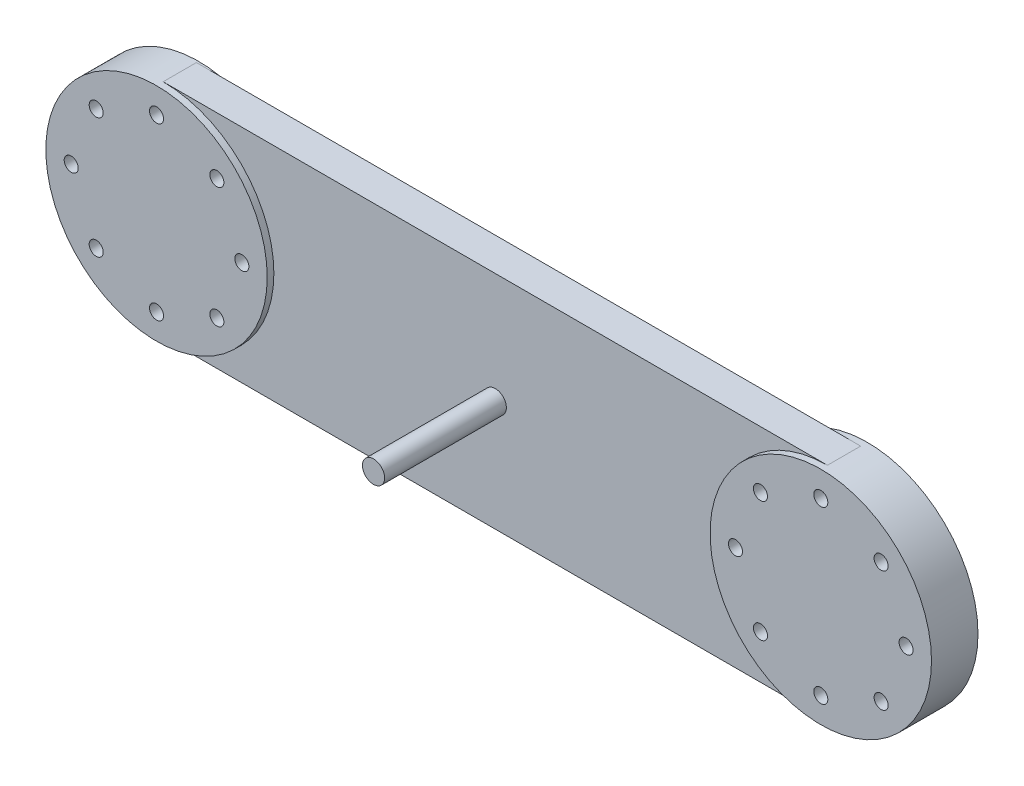
ISO-10303-21;
HEADER;
FILE_DESCRIPTION(('STEP AP214'),'2;1');
FILE_NAME('part.step','',(''),(''),'','','');
FILE_SCHEMA(('AUTOMOTIVE_DESIGN { 1 0 10303 214 1 1 1 1 }'));
ENDSEC;
DATA;
#1=APPLICATION_CONTEXT('core data for automotive mechanical design processes');
#2=APPLICATION_PROTOCOL_DEFINITION('international standard','automotive_design',2000,#1);
#3=PRODUCT_CONTEXT('',#1,'mechanical');
#4=PRODUCT('Part','Part','',(#3));
#5=PRODUCT_RELATED_PRODUCT_CATEGORY('part','',(#4));
#6=PRODUCT_DEFINITION_FORMATION('','',#4);
#7=PRODUCT_DEFINITION_CONTEXT('part definition',#1,'design');
#8=PRODUCT_DEFINITION('design','',#6,#7);
#9=PRODUCT_DEFINITION_SHAPE('','',#8);
#10=(LENGTH_UNIT() NAMED_UNIT(*) SI_UNIT(.MILLI.,.METRE.));
#11=(NAMED_UNIT(*) PLANE_ANGLE_UNIT() SI_UNIT($,.RADIAN.));
#12=(NAMED_UNIT(*) SI_UNIT($,.STERADIAN.) SOLID_ANGLE_UNIT());
#13=UNCERTAINTY_MEASURE_WITH_UNIT(LENGTH_MEASURE(1.E-05),#10,'distance_accuracy_value','');
#14=(GEOMETRIC_REPRESENTATION_CONTEXT(3) GLOBAL_UNCERTAINTY_ASSIGNED_CONTEXT((#13)) GLOBAL_UNIT_ASSIGNED_CONTEXT((#10,
#11,#12)) REPRESENTATION_CONTEXT('',''));
#15=CARTESIAN_POINT('',(0.,0.,0.));
#16=DIRECTION('',(0.,0.,1.));
#17=DIRECTION('',(1.,0.,0.));
#18=AXIS2_PLACEMENT_3D('',#15,#16,#17);
#19=CARTESIAN_POINT('',(-300.,50.,0.));
#20=DIRECTION('',(0.,0.,1.));
#21=DIRECTION('',(1.,0.,0.));
#22=AXIS2_PLACEMENT_3D('',#19,#20,#21);
#23=PLANE('',#22);
#24=CARTESIAN_POINT('',(0.,50.,0.));
#25=DIRECTION('',(0.,0.,1.));
#26=DIRECTION('',(1.,0.,0.));
#27=AXIS2_PLACEMENT_3D('',#24,#25,#26);
#28=CIRCLE('',#27,50.);
#29=CARTESIAN_POINT('',(0.,100.,0.));
#30=VERTEX_POINT('',#29);
#31=CARTESIAN_POINT('',(0.,0.,0.));
#32=VERTEX_POINT('',#31);
#33=EDGE_CURVE('E140',#30,#32,#28,.T.);
#34=ORIENTED_EDGE('',*,*,#33,.T.);
#35=DIRECTION('',(-1.,0.,0.));
#36=VECTOR('',#35,1.);
#37=CARTESIAN_POINT('',(0.,0.,0.));
#38=LINE('',#37,#36);
#39=CARTESIAN_POINT('',(-300.,0.,0.));
#40=VERTEX_POINT('',#39);
#41=EDGE_CURVE('E148',#32,#40,#38,.T.);
#42=ORIENTED_EDGE('',*,*,#41,.T.);
#43=CARTESIAN_POINT('',(-300.,50.,0.));
#44=DIRECTION('',(0.,0.,1.));
#45=DIRECTION('',(1.,0.,0.));
#46=AXIS2_PLACEMENT_3D('',#43,#44,#45);
#47=CIRCLE('',#46,50.);
#48=CARTESIAN_POINT('',(-300.,100.,0.));
#49=VERTEX_POINT('',#48);
#50=EDGE_CURVE('E287',#40,#49,#47,.T.);
#51=ORIENTED_EDGE('',*,*,#50,.T.);
#52=DIRECTION('',(-1.,0.,0.));
#53=VECTOR('',#52,1.);
#54=CARTESIAN_POINT('',(0.,100.,0.));
#55=LINE('',#54,#53);
#56=EDGE_CURVE('E159',#30,#49,#55,.T.);
#57=ORIENTED_EDGE('',*,*,#56,.F.);
#58=EDGE_LOOP('',(#34,#42,#51,#57));
#59=FACE_BOUND('',#58,.T.);
#60=ADVANCED_FACE('F91',(#59),#23,.F.);
#61=CARTESIAN_POINT('',(0.,100.,15.));
#62=DIRECTION('',(0.,-1.,0.));
#63=DIRECTION('',(1.,0.,0.));
#64=AXIS2_PLACEMENT_3D('',#61,#62,#63);
#65=PLANE('',#64);
#66=ORIENTED_EDGE('',*,*,#56,.T.);
#67=DIRECTION('',(0.,0.,-1.));
#68=VECTOR('',#67,1.);
#69=CARTESIAN_POINT('',(-300.,100.,15.));
#70=LINE('',#69,#68);
#71=CARTESIAN_POINT('',(-300.,100.,15.));
#72=VERTEX_POINT('',#71);
#73=EDGE_CURVE('E168',#72,#49,#70,.T.);
#74=ORIENTED_EDGE('',*,*,#73,.F.);
#75=DIRECTION('',(-1.,0.,0.));
#76=VECTOR('',#75,1.);
#77=CARTESIAN_POINT('',(0.,100.,15.));
#78=LINE('',#77,#76);
#79=CARTESIAN_POINT('',(0.,100.,15.));
#80=VERTEX_POINT('',#79);
#81=EDGE_CURVE('E153',#80,#72,#78,.T.);
#82=ORIENTED_EDGE('',*,*,#81,.F.);
#83=DIRECTION('',(0.,0.,-1.));
#84=VECTOR('',#83,1.);
#85=CARTESIAN_POINT('',(0.,100.,15.));
#86=LINE('',#85,#84);
#87=EDGE_CURVE('E100',#80,#30,#86,.T.);
#88=ORIENTED_EDGE('',*,*,#87,.T.);
#89=EDGE_LOOP('',(#66,#74,#82,#88));
#90=FACE_BOUND('',#89,.T.);
#91=ADVANCED_FACE('F310',(#90),#65,.F.);
#92=CARTESIAN_POINT('',(0.,0.,15.));
#93=DIRECTION('',(0.,-1.,0.));
#94=DIRECTION('',(1.,0.,0.));
#95=AXIS2_PLACEMENT_3D('',#92,#93,#94);
#96=PLANE('',#95);
#97=ORIENTED_EDGE('',*,*,#41,.F.);
#98=DIRECTION('',(0.,0.,-1.));
#99=VECTOR('',#98,1.);
#100=CARTESIAN_POINT('',(0.,0.,15.));
#101=LINE('',#100,#99);
#102=CARTESIAN_POINT('',(0.,0.,15.));
#103=VERTEX_POINT('',#102);
#104=EDGE_CURVE('E132',#103,#32,#101,.T.);
#105=ORIENTED_EDGE('',*,*,#104,.F.);
#106=DIRECTION('',(-1.,0.,0.));
#107=VECTOR('',#106,1.);
#108=CARTESIAN_POINT('',(0.,0.,15.));
#109=LINE('',#108,#107);
#110=CARTESIAN_POINT('',(-300.,0.,15.));
#111=VERTEX_POINT('',#110);
#112=EDGE_CURVE('E146',#103,#111,#109,.T.);
#113=ORIENTED_EDGE('',*,*,#112,.T.);
#114=DIRECTION('',(0.,0.,-1.));
#115=VECTOR('',#114,1.);
#116=CARTESIAN_POINT('',(-300.,0.,15.));
#117=LINE('',#116,#115);
#118=EDGE_CURVE('E108',#111,#40,#117,.T.);
#119=ORIENTED_EDGE('',*,*,#118,.T.);
#120=EDGE_LOOP('',(#97,#105,#113,#119));
#121=FACE_BOUND('',#120,.T.);
#122=ADVANCED_FACE('F145',(#121),#96,.T.);
#123=CARTESIAN_POINT('',(0.,0.,15.));
#124=DIRECTION('',(0.,0.,1.));
#125=DIRECTION('',(1.,0.,0.));
#126=AXIS2_PLACEMENT_3D('',#123,#124,#125);
#127=PLANE('',#126);
#128=CARTESIAN_POINT('',(-150.,49.9999999999999,15.));
#129=DIRECTION('',(0.,0.,1.));
#130=DIRECTION('',(1.,0.,0.));
#131=AXIS2_PLACEMENT_3D('',#128,#129,#130);
#132=CIRCLE('',#131,4.99999999999999);
#133=CARTESIAN_POINT('',(-145.,49.9999999999999,15.));
#134=VERTEX_POINT('',#133);
#135=EDGE_CURVE('E163',#134,#134,#132,.F.);
#136=ORIENTED_EDGE('',*,*,#135,.T.);
#137=EDGE_LOOP('',(#136));
#138=FACE_BOUND('',#137,.T.);
#139=ORIENTED_EDGE('',*,*,#112,.F.);
#140=CARTESIAN_POINT('',(0.,50.,15.));
#141=DIRECTION('',(0.,0.,1.));
#142=DIRECTION('',(1.,0.,0.));
#143=AXIS2_PLACEMENT_3D('',#140,#141,#142);
#144=CIRCLE('',#143,50.);
#145=EDGE_CURVE('E129',#103,#80,#144,.F.);
#146=ORIENTED_EDGE('',*,*,#145,.T.);
#147=ORIENTED_EDGE('',*,*,#81,.T.);
#148=CARTESIAN_POINT('',(-300.,50.,15.));
#149=DIRECTION('',(0.,0.,1.));
#150=DIRECTION('',(1.,0.,0.));
#151=AXIS2_PLACEMENT_3D('',#148,#149,#150);
#152=CIRCLE('',#151,50.);
#153=EDGE_CURVE('E12',#72,#111,#152,.F.);
#154=ORIENTED_EDGE('',*,*,#153,.T.);
#155=EDGE_LOOP('',(#139,#146,#147,#154));
#156=FACE_BOUND('',#155,.T.);
#157=ADVANCED_FACE('F151',(#138,#156),#127,.T.);
#158=CARTESIAN_POINT('',(-150.,49.9999999999999,70.));
#159=DIRECTION('',(0.,0.,-1.));
#160=DIRECTION('',(-1.,0.,0.));
#161=AXIS2_PLACEMENT_3D('',#158,#159,#160);
#162=CYLINDRICAL_SURFACE('',#161,4.99999999999999);
#163=ORIENTED_EDGE('',*,*,#135,.F.);
#164=EDGE_LOOP('',(#163));
#165=FACE_BOUND('',#164,.T.);
#166=CARTESIAN_POINT('',(-150.,49.9999999999999,70.));
#167=DIRECTION('',(0.,0.,1.));
#168=DIRECTION('',(1.,0.,0.));
#169=AXIS2_PLACEMENT_3D('',#166,#167,#168);
#170=CIRCLE('',#169,4.99999999999999);
#171=CARTESIAN_POINT('',(-145.,49.9999999999999,70.));
#172=VERTEX_POINT('',#171);
#173=EDGE_CURVE('E175',#172,#172,#170,.T.);
#174=ORIENTED_EDGE('',*,*,#173,.F.);
#175=EDGE_LOOP('',(#174));
#176=FACE_BOUND('',#175,.T.);
#177=ADVANCED_FACE('F296',(#165,#176),#162,.T.);
#178=CARTESIAN_POINT('',(-150.,49.9999999999999,70.));
#179=DIRECTION('',(0.,0.,1.));
#180=DIRECTION('',(1.,0.,0.));
#181=AXIS2_PLACEMENT_3D('',#178,#179,#180);
#182=PLANE('',#181);
#183=ORIENTED_EDGE('',*,*,#173,.T.);
#184=EDGE_LOOP('',(#183));
#185=FACE_BOUND('',#184,.T.);
#186=ADVANCED_FACE('F294',(#185),#182,.T.);
#187=CARTESIAN_POINT('',(-300.,50.,-0.999999999999997));
#188=DIRECTION('',(0.,0.,1.));
#189=DIRECTION('',(1.,0.,0.));
#190=AXIS2_PLACEMENT_3D('',#187,#188,#189);
#191=CYLINDRICAL_SURFACE('',#190,50.);
#192=CARTESIAN_POINT('',(-300.,50.,18.));
#193=DIRECTION('',(0.,0.,1.));
#194=DIRECTION('',(1.,0.,0.));
#195=AXIS2_PLACEMENT_3D('',#192,#193,#194);
#196=CIRCLE('',#195,50.);
#197=CARTESIAN_POINT('',(-250.,50.,18.));
#198=VERTEX_POINT('',#197);
#199=EDGE_CURVE('E279',#198,#198,#196,.T.);
#200=ORIENTED_EDGE('',*,*,#199,.F.);
#201=EDGE_LOOP('',(#200));
#202=FACE_BOUND('',#201,.T.);
#203=CARTESIAN_POINT('',(-300.,50.,-0.999999999999997));
#204=DIRECTION('',(0.,0.,1.));
#205=DIRECTION('',(1.,0.,0.));
#206=AXIS2_PLACEMENT_3D('',#203,#204,#205);
#207=CIRCLE('',#206,50.);
#208=CARTESIAN_POINT('',(-250.,50.,-0.999999999999997));
#209=VERTEX_POINT('',#208);
#210=EDGE_CURVE('E283',#209,#209,#207,.T.);
#211=ORIENTED_EDGE('',*,*,#210,.T.);
#212=EDGE_LOOP('',(#211));
#213=FACE_BOUND('',#212,.T.);
#214=ORIENTED_EDGE('',*,*,#50,.F.);
#215=ORIENTED_EDGE('',*,*,#118,.F.);
#216=ORIENTED_EDGE('',*,*,#153,.F.);
#217=ORIENTED_EDGE('',*,*,#73,.T.);
#218=EDGE_LOOP('',(#214,#215,#216,#217));
#219=FACE_BOUND('',#218,.T.);
#220=ADVANCED_FACE('F304',(#202,#213,#219),#191,.T.);
#221=CARTESIAN_POINT('',(-300.,50.,-0.999999999999997));
#222=DIRECTION('',(0.,0.,1.));
#223=DIRECTION('',(1.,0.,0.));
#224=AXIS2_PLACEMENT_3D('',#221,#222,#223);
#225=PLANE('',#224);
#226=CARTESIAN_POINT('',(-272.754935969733,22.7549359697327,-1.));
#227=DIRECTION('',(0.,0.,1.));
#228=DIRECTION('',(1.,0.,0.));
#229=AXIS2_PLACEMENT_3D('',#226,#227,#228);
#230=CIRCLE('',#229,3.17499999999995);
#231=CARTESIAN_POINT('',(-269.579935969733,22.7549359697327,-1.));
#232=VERTEX_POINT('',#231);
#233=EDGE_CURVE('E262',#232,#232,#230,.T.);
#234=ORIENTED_EDGE('',*,*,#233,.T.);
#235=EDGE_LOOP('',(#234));
#236=FACE_BOUND('',#235,.T.);
#237=CARTESIAN_POINT('',(-300.,11.4696609406727,-1.));
#238=DIRECTION('',(0.,0.,1.));
#239=DIRECTION('',(1.,0.,0.));
#240=AXIS2_PLACEMENT_3D('',#237,#238,#239);
#241=CIRCLE('',#240,3.17499999999997);
#242=CARTESIAN_POINT('',(-296.825,11.4696609406727,-1.));
#243=VERTEX_POINT('',#242);
#244=EDGE_CURVE('E248',#243,#243,#241,.T.);
#245=ORIENTED_EDGE('',*,*,#244,.T.);
#246=EDGE_LOOP('',(#245));
#247=FACE_BOUND('',#246,.T.);
#248=CARTESIAN_POINT('',(-327.245064030267,22.7549359697329,-1.));
#249=DIRECTION('',(0.,0.,1.));
#250=DIRECTION('',(1.,0.,0.));
#251=AXIS2_PLACEMENT_3D('',#248,#249,#250);
#252=CIRCLE('',#251,3.17499999999995);
#253=CARTESIAN_POINT('',(-324.070064030267,22.7549359697329,-1.));
#254=VERTEX_POINT('',#253);
#255=EDGE_CURVE('E244',#254,#254,#252,.T.);
#256=ORIENTED_EDGE('',*,*,#255,.T.);
#257=EDGE_LOOP('',(#256));
#258=FACE_BOUND('',#257,.T.);
#259=CARTESIAN_POINT('',(-338.530339059327,50.0000000000003,-1.));
#260=DIRECTION('',(0.,0.,1.));
#261=DIRECTION('',(1.,0.,0.));
#262=AXIS2_PLACEMENT_3D('',#259,#260,#261);
#263=CIRCLE('',#262,3.17499999999996);
#264=CARTESIAN_POINT('',(-335.355339059327,50.0000000000003,-1.));
#265=VERTEX_POINT('',#264);
#266=EDGE_CURVE('E240',#265,#265,#263,.T.);
#267=ORIENTED_EDGE('',*,*,#266,.T.);
#268=EDGE_LOOP('',(#267));
#269=FACE_BOUND('',#268,.T.);
#270=CARTESIAN_POINT('',(-327.245064030267,77.2450640302675,-1.));
#271=DIRECTION('',(0.,0.,1.));
#272=DIRECTION('',(1.,0.,0.));
#273=AXIS2_PLACEMENT_3D('',#270,#271,#272);
#274=CIRCLE('',#273,3.17499999999997);
#275=CARTESIAN_POINT('',(-324.070064030267,77.2450640302675,-1.));
#276=VERTEX_POINT('',#275);
#277=EDGE_CURVE('E235',#276,#276,#274,.T.);
#278=ORIENTED_EDGE('',*,*,#277,.T.);
#279=EDGE_LOOP('',(#278));
#280=FACE_BOUND('',#279,.T.);
#281=CARTESIAN_POINT('',(-300.,88.5303390593272,-1.));
#282=DIRECTION('',(0.,0.,1.));
#283=DIRECTION('',(1.,0.,0.));
#284=AXIS2_PLACEMENT_3D('',#281,#282,#283);
#285=CIRCLE('',#284,3.17500000000002);
#286=CARTESIAN_POINT('',(-296.825,88.5303390593272,-1.));
#287=VERTEX_POINT('',#286);
#288=EDGE_CURVE('E230',#287,#287,#285,.T.);
#289=ORIENTED_EDGE('',*,*,#288,.T.);
#290=EDGE_LOOP('',(#289));
#291=FACE_BOUND('',#290,.T.);
#292=CARTESIAN_POINT('',(-272.754935969732,77.2450640302669,-1.));
#293=DIRECTION('',(0.,0.,1.));
#294=DIRECTION('',(1.,0.,0.));
#295=AXIS2_PLACEMENT_3D('',#292,#293,#294);
#296=CIRCLE('',#295,3.17499999999998);
#297=CARTESIAN_POINT('',(-269.579935969732,77.2450640302669,-1.));
#298=VERTEX_POINT('',#297);
#299=EDGE_CURVE('E225',#298,#298,#296,.T.);
#300=ORIENTED_EDGE('',*,*,#299,.T.);
#301=EDGE_LOOP('',(#300));
#302=FACE_BOUND('',#301,.T.);
#303=CARTESIAN_POINT('',(-261.469660940673,50.,-1.));
#304=DIRECTION('',(0.,0.,1.));
#305=DIRECTION('',(1.,0.,0.));
#306=AXIS2_PLACEMENT_3D('',#303,#304,#305);
#307=CIRCLE('',#306,3.17499999999997);
#308=CARTESIAN_POINT('',(-258.294660940673,50.,-1.));
#309=VERTEX_POINT('',#308);
#310=EDGE_CURVE('E180',#309,#309,#307,.F.);
#311=ORIENTED_EDGE('',*,*,#310,.F.);
#312=EDGE_LOOP('',(#311));
#313=FACE_BOUND('',#312,.T.);
#314=ORIENTED_EDGE('',*,*,#210,.F.);
#315=EDGE_LOOP('',(#314));
#316=FACE_BOUND('',#315,.T.);
#317=ADVANCED_FACE('F319',(#236,#247,#258,#269,#280,#291,#302,#313,#316),#225,.F.);
#318=CARTESIAN_POINT('',(-300.,50.,18.));
#319=DIRECTION('',(0.,0.,1.));
#320=DIRECTION('',(1.,0.,0.));
#321=AXIS2_PLACEMENT_3D('',#318,#319,#320);
#322=PLANE('',#321);
#323=CARTESIAN_POINT('',(-272.754935969733,22.7549359697327,18.));
#324=DIRECTION('',(0.,0.,1.));
#325=DIRECTION('',(1.,0.,0.));
#326=AXIS2_PLACEMENT_3D('',#323,#324,#325);
#327=CIRCLE('',#326,3.17499999999995);
#328=CARTESIAN_POINT('',(-269.579935969733,22.7549359697327,18.));
#329=VERTEX_POINT('',#328);
#330=EDGE_CURVE('E94',#329,#329,#327,.T.);
#331=ORIENTED_EDGE('',*,*,#330,.F.);
#332=EDGE_LOOP('',(#331));
#333=FACE_BOUND('',#332,.T.);
#334=CARTESIAN_POINT('',(-300.,11.4696609406727,18.));
#335=DIRECTION('',(0.,0.,1.));
#336=DIRECTION('',(1.,0.,0.));
#337=AXIS2_PLACEMENT_3D('',#334,#335,#336);
#338=CIRCLE('',#337,3.17499999999997);
#339=CARTESIAN_POINT('',(-296.825,11.4696609406727,18.));
#340=VERTEX_POINT('',#339);
#341=EDGE_CURVE('E245',#340,#340,#338,.T.);
#342=ORIENTED_EDGE('',*,*,#341,.F.);
#343=EDGE_LOOP('',(#342));
#344=FACE_BOUND('',#343,.T.);
#345=CARTESIAN_POINT('',(-327.245064030267,22.7549359697329,18.));
#346=DIRECTION('',(0.,0.,1.));
#347=DIRECTION('',(1.,0.,0.));
#348=AXIS2_PLACEMENT_3D('',#345,#346,#347);
#349=CIRCLE('',#348,3.17499999999995);
#350=CARTESIAN_POINT('',(-324.070064030267,22.7549359697329,18.));
#351=VERTEX_POINT('',#350);
#352=EDGE_CURVE('E241',#351,#351,#349,.T.);
#353=ORIENTED_EDGE('',*,*,#352,.F.);
#354=EDGE_LOOP('',(#353));
#355=FACE_BOUND('',#354,.T.);
#356=CARTESIAN_POINT('',(-338.530339059327,50.0000000000003,18.));
#357=DIRECTION('',(0.,0.,1.));
#358=DIRECTION('',(1.,0.,0.));
#359=AXIS2_PLACEMENT_3D('',#356,#357,#358);
#360=CIRCLE('',#359,3.17499999999996);
#361=CARTESIAN_POINT('',(-335.355339059327,50.0000000000003,18.));
#362=VERTEX_POINT('',#361);
#363=EDGE_CURVE('E236',#362,#362,#360,.T.);
#364=ORIENTED_EDGE('',*,*,#363,.F.);
#365=EDGE_LOOP('',(#364));
#366=FACE_BOUND('',#365,.T.);
#367=CARTESIAN_POINT('',(-327.245064030267,77.2450640302675,18.));
#368=DIRECTION('',(0.,0.,1.));
#369=DIRECTION('',(1.,0.,0.));
#370=AXIS2_PLACEMENT_3D('',#367,#368,#369);
#371=CIRCLE('',#370,3.17499999999997);
#372=CARTESIAN_POINT('',(-324.070064030267,77.2450640302675,18.));
#373=VERTEX_POINT('',#372);
#374=EDGE_CURVE('E231',#373,#373,#371,.T.);
#375=ORIENTED_EDGE('',*,*,#374,.F.);
#376=EDGE_LOOP('',(#375));
#377=FACE_BOUND('',#376,.T.);
#378=CARTESIAN_POINT('',(-300.,88.5303390593272,18.));
#379=DIRECTION('',(0.,0.,1.));
#380=DIRECTION('',(1.,0.,0.));
#381=AXIS2_PLACEMENT_3D('',#378,#379,#380);
#382=CIRCLE('',#381,3.17500000000002);
#383=CARTESIAN_POINT('',(-296.825,88.5303390593272,18.));
#384=VERTEX_POINT('',#383);
#385=EDGE_CURVE('E226',#384,#384,#382,.T.);
#386=ORIENTED_EDGE('',*,*,#385,.F.);
#387=EDGE_LOOP('',(#386));
#388=FACE_BOUND('',#387,.T.);
#389=CARTESIAN_POINT('',(-272.754935969732,77.2450640302669,18.));
#390=DIRECTION('',(0.,0.,1.));
#391=DIRECTION('',(1.,0.,0.));
#392=AXIS2_PLACEMENT_3D('',#389,#390,#391);
#393=CIRCLE('',#392,3.17499999999998);
#394=CARTESIAN_POINT('',(-269.579935969732,77.2450640302669,18.));
#395=VERTEX_POINT('',#394);
#396=EDGE_CURVE('E221',#395,#395,#393,.T.);
#397=ORIENTED_EDGE('',*,*,#396,.F.);
#398=EDGE_LOOP('',(#397));
#399=FACE_BOUND('',#398,.T.);
#400=CARTESIAN_POINT('',(-261.469660940673,50.,18.));
#401=DIRECTION('',(0.,0.,1.));
#402=DIRECTION('',(1.,0.,0.));
#403=AXIS2_PLACEMENT_3D('',#400,#401,#402);
#404=CIRCLE('',#403,3.17499999999997);
#405=CARTESIAN_POINT('',(-258.294660940673,50.,18.));
#406=VERTEX_POINT('',#405);
#407=EDGE_CURVE('E139',#406,#406,#404,.F.);
#408=ORIENTED_EDGE('',*,*,#407,.T.);
#409=EDGE_LOOP('',(#408));
#410=FACE_BOUND('',#409,.T.);
#411=ORIENTED_EDGE('',*,*,#199,.T.);
#412=EDGE_LOOP('',(#411));
#413=FACE_BOUND('',#412,.T.);
#414=ADVANCED_FACE('F325',(#333,#344,#355,#366,#377,#388,#399,#410,#413),#322,.T.);
#415=CARTESIAN_POINT('',(-261.469660940673,50.,130.));
#416=DIRECTION('',(0.,0.,-1.));
#417=DIRECTION('',(-1.,0.,0.));
#418=AXIS2_PLACEMENT_3D('',#415,#416,#417);
#419=CYLINDRICAL_SURFACE('',#418,3.17499999999997);
#420=ORIENTED_EDGE('',*,*,#407,.F.);
#421=EDGE_LOOP('',(#420));
#422=FACE_BOUND('',#421,.T.);
#423=ORIENTED_EDGE('',*,*,#310,.T.);
#424=EDGE_LOOP('',(#423));
#425=FACE_BOUND('',#424,.T.);
#426=ADVANCED_FACE('F333',(#422,#425),#419,.F.);
#427=CARTESIAN_POINT('',(0.,50.,18.));
#428=DIRECTION('',(0.,0.,-1.));
#429=DIRECTION('',(-1.,0.,0.));
#430=AXIS2_PLACEMENT_3D('',#427,#428,#429);
#431=CYLINDRICAL_SURFACE('',#430,50.);
#432=CARTESIAN_POINT('',(0.,50.,18.));
#433=DIRECTION('',(0.,0.,1.));
#434=DIRECTION('',(1.,0.,0.));
#435=AXIS2_PLACEMENT_3D('',#432,#433,#434);
#436=CIRCLE('',#435,50.);
#437=CARTESIAN_POINT('',(50.,50.,18.));
#438=VERTEX_POINT('',#437);
#439=EDGE_CURVE('E270',#438,#438,#436,.T.);
#440=ORIENTED_EDGE('',*,*,#439,.F.);
#441=EDGE_LOOP('',(#440));
#442=FACE_BOUND('',#441,.T.);
#443=CARTESIAN_POINT('',(0.,50.,-3.));
#444=DIRECTION('',(0.,0.,1.));
#445=DIRECTION('',(1.,0.,0.));
#446=AXIS2_PLACEMENT_3D('',#443,#444,#445);
#447=CIRCLE('',#446,50.);
#448=CARTESIAN_POINT('',(50.,50.,-3.));
#449=VERTEX_POINT('',#448);
#450=EDGE_CURVE('E266',#449,#449,#447,.T.);
#451=ORIENTED_EDGE('',*,*,#450,.T.);
#452=EDGE_LOOP('',(#451));
#453=FACE_BOUND('',#452,.T.);
#454=ORIENTED_EDGE('',*,*,#104,.T.);
#455=ORIENTED_EDGE('',*,*,#33,.F.);
#456=ORIENTED_EDGE('',*,*,#87,.F.);
#457=ORIENTED_EDGE('',*,*,#145,.F.);
#458=EDGE_LOOP('',(#454,#455,#456,#457));
#459=FACE_BOUND('',#458,.T.);
#460=ADVANCED_FACE('F131',(#442,#453,#459),#431,.T.);
#461=CARTESIAN_POINT('',(0.,50.,18.));
#462=DIRECTION('',(0.,0.,1.));
#463=DIRECTION('',(1.,0.,0.));
#464=AXIS2_PLACEMENT_3D('',#461,#462,#463);
#465=PLANE('',#464);
#466=CARTESIAN_POINT('',(-27.2450640302676,22.754935969733,18.));
#467=DIRECTION('',(0.,0.,1.));
#468=DIRECTION('',(1.,0.,0.));
#469=AXIS2_PLACEMENT_3D('',#466,#467,#468);
#470=CIRCLE('',#469,3.17500000000001);
#471=CARTESIAN_POINT('',(-24.0700640302676,22.754935969733,18.));
#472=VERTEX_POINT('',#471);
#473=EDGE_CURVE('E220',#472,#472,#470,.F.);
#474=ORIENTED_EDGE('',*,*,#473,.T.);
#475=EDGE_LOOP('',(#474));
#476=FACE_BOUND('',#475,.T.);
#477=CARTESIAN_POINT('',(-3.7470027081099E-13,11.4696609406726,18.));
#478=DIRECTION('',(0.,0.,1.));
#479=DIRECTION('',(1.,0.,0.));
#480=AXIS2_PLACEMENT_3D('',#477,#478,#479);
#481=CIRCLE('',#480,3.175);
#482=CARTESIAN_POINT('',(3.17499999999962,11.4696609406726,18.));
#483=VERTEX_POINT('',#482);
#484=EDGE_CURVE('E215',#483,#483,#481,.F.);
#485=ORIENTED_EDGE('',*,*,#484,.T.);
#486=EDGE_LOOP('',(#485));
#487=FACE_BOUND('',#486,.T.);
#488=CARTESIAN_POINT('',(38.5303390593274,49.9999999999998,18.));
#489=DIRECTION('',(0.,0.,1.));
#490=DIRECTION('',(1.,0.,0.));
#491=AXIS2_PLACEMENT_3D('',#488,#489,#490);
#492=CIRCLE('',#491,3.175);
#493=CARTESIAN_POINT('',(41.7053390593274,49.9999999999998,18.));
#494=VERTEX_POINT('',#493);
#495=EDGE_CURVE('E210',#494,#494,#492,.F.);
#496=ORIENTED_EDGE('',*,*,#495,.T.);
#497=EDGE_LOOP('',(#496));
#498=FACE_BOUND('',#497,.T.);
#499=CARTESIAN_POINT('',(27.2450640302671,22.7549359697325,18.));
#500=DIRECTION('',(0.,0.,1.));
#501=DIRECTION('',(1.,0.,0.));
#502=AXIS2_PLACEMENT_3D('',#499,#500,#501);
#503=CIRCLE('',#502,3.175);
#504=CARTESIAN_POINT('',(30.4200640302671,22.7549359697325,18.));
#505=VERTEX_POINT('',#504);
#506=EDGE_CURVE('E205',#505,#505,#503,.F.);
#507=ORIENTED_EDGE('',*,*,#506,.T.);
#508=EDGE_LOOP('',(#507));
#509=FACE_BOUND('',#508,.T.);
#510=CARTESIAN_POINT('',(27.2450640302674,77.2450640302672,18.));
#511=DIRECTION('',(0.,0.,1.));
#512=DIRECTION('',(1.,0.,0.));
#513=AXIS2_PLACEMENT_3D('',#510,#511,#512);
#514=CIRCLE('',#513,3.175);
#515=CARTESIAN_POINT('',(30.4200640302674,77.2450640302672,18.));
#516=VERTEX_POINT('',#515);
#517=EDGE_CURVE('E200',#516,#516,#514,.F.);
#518=ORIENTED_EDGE('',*,*,#517,.T.);
#519=EDGE_LOOP('',(#518));
#520=FACE_BOUND('',#519,.T.);
#521=CARTESIAN_POINT('',(0.,88.5303390593274,18.));
#522=DIRECTION('',(0.,0.,1.));
#523=DIRECTION('',(1.,0.,0.));
#524=AXIS2_PLACEMENT_3D('',#521,#522,#523);
#525=CIRCLE('',#524,3.17499999999999);
#526=CARTESIAN_POINT('',(3.17500000000009,88.5303390593274,18.));
#527=VERTEX_POINT('',#526);
#528=EDGE_CURVE('E195',#527,#527,#525,.F.);
#529=ORIENTED_EDGE('',*,*,#528,.T.);
#530=EDGE_LOOP('',(#529));
#531=FACE_BOUND('',#530,.T.);
#532=CARTESIAN_POINT('',(-27.2450640302676,77.2450640302669,18.));
#533=DIRECTION('',(0.,0.,1.));
#534=DIRECTION('',(1.,0.,0.));
#535=AXIS2_PLACEMENT_3D('',#532,#533,#534);
#536=CIRCLE('',#535,3.17499999999998);
#537=CARTESIAN_POINT('',(-24.0700640302676,77.2450640302669,18.));
#538=VERTEX_POINT('',#537);
#539=EDGE_CURVE('E190',#538,#538,#536,.F.);
#540=ORIENTED_EDGE('',*,*,#539,.T.);
#541=EDGE_LOOP('',(#540));
#542=FACE_BOUND('',#541,.T.);
#543=CARTESIAN_POINT('',(-38.5303390593274,50.,18.));
#544=DIRECTION('',(0.,0.,1.));
#545=DIRECTION('',(1.,0.,0.));
#546=AXIS2_PLACEMENT_3D('',#543,#544,#545);
#547=CIRCLE('',#546,3.175);
#548=CARTESIAN_POINT('',(-35.3553390593274,50.,18.));
#549=VERTEX_POINT('',#548);
#550=EDGE_CURVE('E185',#549,#549,#547,.F.);
#551=ORIENTED_EDGE('',*,*,#550,.T.);
#552=EDGE_LOOP('',(#551));
#553=FACE_BOUND('',#552,.T.);
#554=ORIENTED_EDGE('',*,*,#439,.T.);
#555=EDGE_LOOP('',(#554));
#556=FACE_BOUND('',#555,.T.);
#557=ADVANCED_FACE('F340',(#476,#487,#498,#509,#520,#531,#542,#553,#556),#465,.T.);
#558=CARTESIAN_POINT('',(0.,50.,-3.));
#559=DIRECTION('',(0.,0.,1.));
#560=DIRECTION('',(1.,0.,0.));
#561=AXIS2_PLACEMENT_3D('',#558,#559,#560);
#562=PLANE('',#561);
#563=CARTESIAN_POINT('',(-27.2450640302676,22.754935969733,-3.));
#564=DIRECTION('',(0.,0.,1.));
#565=DIRECTION('',(1.,0.,0.));
#566=AXIS2_PLACEMENT_3D('',#563,#564,#565);
#567=CIRCLE('',#566,3.17500000000001);
#568=CARTESIAN_POINT('',(-24.0700640302676,22.754935969733,-3.));
#569=VERTEX_POINT('',#568);
#570=EDGE_CURVE('E216',#569,#569,#567,.F.);
#571=ORIENTED_EDGE('',*,*,#570,.F.);
#572=EDGE_LOOP('',(#571));
#573=FACE_BOUND('',#572,.T.);
#574=CARTESIAN_POINT('',(-3.7470027081099E-13,11.4696609406726,-3.));
#575=DIRECTION('',(0.,0.,1.));
#576=DIRECTION('',(1.,0.,0.));
#577=AXIS2_PLACEMENT_3D('',#574,#575,#576);
#578=CIRCLE('',#577,3.175);
#579=CARTESIAN_POINT('',(3.17499999999962,11.4696609406726,-3.));
#580=VERTEX_POINT('',#579);
#581=EDGE_CURVE('E211',#580,#580,#578,.F.);
#582=ORIENTED_EDGE('',*,*,#581,.F.);
#583=EDGE_LOOP('',(#582));
#584=FACE_BOUND('',#583,.T.);
#585=CARTESIAN_POINT('',(38.5303390593274,49.9999999999998,-3.));
#586=DIRECTION('',(0.,0.,1.));
#587=DIRECTION('',(1.,0.,0.));
#588=AXIS2_PLACEMENT_3D('',#585,#586,#587);
#589=CIRCLE('',#588,3.175);
#590=CARTESIAN_POINT('',(41.7053390593274,49.9999999999998,-3.));
#591=VERTEX_POINT('',#590);
#592=EDGE_CURVE('E206',#591,#591,#589,.F.);
#593=ORIENTED_EDGE('',*,*,#592,.F.);
#594=EDGE_LOOP('',(#593));
#595=FACE_BOUND('',#594,.T.);
#596=CARTESIAN_POINT('',(27.2450640302671,22.7549359697325,-3.));
#597=DIRECTION('',(0.,0.,1.));
#598=DIRECTION('',(1.,0.,0.));
#599=AXIS2_PLACEMENT_3D('',#596,#597,#598);
#600=CIRCLE('',#599,3.175);
#601=CARTESIAN_POINT('',(30.4200640302671,22.7549359697325,-3.));
#602=VERTEX_POINT('',#601);
#603=EDGE_CURVE('E201',#602,#602,#600,.F.);
#604=ORIENTED_EDGE('',*,*,#603,.F.);
#605=EDGE_LOOP('',(#604));
#606=FACE_BOUND('',#605,.T.);
#607=CARTESIAN_POINT('',(27.2450640302674,77.2450640302672,-3.));
#608=DIRECTION('',(0.,0.,1.));
#609=DIRECTION('',(1.,0.,0.));
#610=AXIS2_PLACEMENT_3D('',#607,#608,#609);
#611=CIRCLE('',#610,3.175);
#612=CARTESIAN_POINT('',(30.4200640302674,77.2450640302672,-3.));
#613=VERTEX_POINT('',#612);
#614=EDGE_CURVE('E196',#613,#613,#611,.F.);
#615=ORIENTED_EDGE('',*,*,#614,.F.);
#616=EDGE_LOOP('',(#615));
#617=FACE_BOUND('',#616,.T.);
#618=CARTESIAN_POINT('',(0.,88.5303390593274,-3.));
#619=DIRECTION('',(0.,0.,1.));
#620=DIRECTION('',(1.,0.,0.));
#621=AXIS2_PLACEMENT_3D('',#618,#619,#620);
#622=CIRCLE('',#621,3.17499999999999);
#623=CARTESIAN_POINT('',(3.17500000000009,88.5303390593274,-3.));
#624=VERTEX_POINT('',#623);
#625=EDGE_CURVE('E191',#624,#624,#622,.F.);
#626=ORIENTED_EDGE('',*,*,#625,.F.);
#627=EDGE_LOOP('',(#626));
#628=FACE_BOUND('',#627,.T.);
#629=CARTESIAN_POINT('',(-27.2450640302676,77.2450640302669,-3.));
#630=DIRECTION('',(0.,0.,1.));
#631=DIRECTION('',(1.,0.,0.));
#632=AXIS2_PLACEMENT_3D('',#629,#630,#631);
#633=CIRCLE('',#632,3.17499999999998);
#634=CARTESIAN_POINT('',(-24.0700640302676,77.2450640302669,-3.));
#635=VERTEX_POINT('',#634);
#636=EDGE_CURVE('E186',#635,#635,#633,.F.);
#637=ORIENTED_EDGE('',*,*,#636,.F.);
#638=EDGE_LOOP('',(#637));
#639=FACE_BOUND('',#638,.T.);
#640=CARTESIAN_POINT('',(-38.5303390593274,50.,-3.));
#641=DIRECTION('',(0.,0.,1.));
#642=DIRECTION('',(1.,0.,0.));
#643=AXIS2_PLACEMENT_3D('',#640,#641,#642);
#644=CIRCLE('',#643,3.175);
#645=CARTESIAN_POINT('',(-35.3553390593274,50.,-3.));
#646=VERTEX_POINT('',#645);
#647=EDGE_CURVE('E181',#646,#646,#644,.F.);
#648=ORIENTED_EDGE('',*,*,#647,.F.);
#649=EDGE_LOOP('',(#648));
#650=FACE_BOUND('',#649,.T.);
#651=ORIENTED_EDGE('',*,*,#450,.F.);
#652=EDGE_LOOP('',(#651));
#653=FACE_BOUND('',#652,.T.);
#654=ADVANCED_FACE('F344',(#573,#584,#595,#606,#617,#628,#639,#650,#653),#562,.F.);
#655=CARTESIAN_POINT('',(-38.5303390593274,50.,-98.));
#656=DIRECTION('',(0.,0.,1.));
#657=DIRECTION('',(1.,0.,0.));
#658=AXIS2_PLACEMENT_3D('',#655,#656,#657);
#659=CYLINDRICAL_SURFACE('',#658,3.175);
#660=ORIENTED_EDGE('',*,*,#550,.F.);
#661=EDGE_LOOP('',(#660));
#662=FACE_BOUND('',#661,.T.);
#663=ORIENTED_EDGE('',*,*,#647,.T.);
#664=EDGE_LOOP('',(#663));
#665=FACE_BOUND('',#664,.T.);
#666=ADVANCED_FACE('F348',(#662,#665),#659,.F.);
#667=CARTESIAN_POINT('',(-27.2450640302676,77.2450640302669,-98.));
#668=DIRECTION('',(0.,0.,1.));
#669=DIRECTION('',(1.,0.,0.));
#670=AXIS2_PLACEMENT_3D('',#667,#668,#669);
#671=CYLINDRICAL_SURFACE('',#670,3.17499999999998);
#672=ORIENTED_EDGE('',*,*,#539,.F.);
#673=EDGE_LOOP('',(#672));
#674=FACE_BOUND('',#673,.T.);
#675=ORIENTED_EDGE('',*,*,#636,.T.);
#676=EDGE_LOOP('',(#675));
#677=FACE_BOUND('',#676,.T.);
#678=ADVANCED_FACE('F390',(#674,#677),#671,.F.);
#679=CARTESIAN_POINT('',(0.,88.5303390593274,-98.));
#680=DIRECTION('',(0.,0.,1.));
#681=DIRECTION('',(1.,0.,0.));
#682=AXIS2_PLACEMENT_3D('',#679,#680,#681);
#683=CYLINDRICAL_SURFACE('',#682,3.17499999999999);
#684=ORIENTED_EDGE('',*,*,#528,.F.);
#685=EDGE_LOOP('',(#684));
#686=FACE_BOUND('',#685,.T.);
#687=ORIENTED_EDGE('',*,*,#625,.T.);
#688=EDGE_LOOP('',(#687));
#689=FACE_BOUND('',#688,.T.);
#690=ADVANCED_FACE('F386',(#686,#689),#683,.F.);
#691=CARTESIAN_POINT('',(27.2450640302674,77.2450640302672,-98.));
#692=DIRECTION('',(0.,0.,1.));
#693=DIRECTION('',(1.,0.,0.));
#694=AXIS2_PLACEMENT_3D('',#691,#692,#693);
#695=CYLINDRICAL_SURFACE('',#694,3.175);
#696=ORIENTED_EDGE('',*,*,#517,.F.);
#697=EDGE_LOOP('',(#696));
#698=FACE_BOUND('',#697,.T.);
#699=ORIENTED_EDGE('',*,*,#614,.T.);
#700=EDGE_LOOP('',(#699));
#701=FACE_BOUND('',#700,.T.);
#702=ADVANCED_FACE('F382',(#698,#701),#695,.F.);
#703=CARTESIAN_POINT('',(27.2450640302671,22.7549359697325,-98.));
#704=DIRECTION('',(0.,0.,1.));
#705=DIRECTION('',(1.,0.,0.));
#706=AXIS2_PLACEMENT_3D('',#703,#704,#705);
#707=CYLINDRICAL_SURFACE('',#706,3.175);
#708=ORIENTED_EDGE('',*,*,#506,.F.);
#709=EDGE_LOOP('',(#708));
#710=FACE_BOUND('',#709,.T.);
#711=ORIENTED_EDGE('',*,*,#603,.T.);
#712=EDGE_LOOP('',(#711));
#713=FACE_BOUND('',#712,.T.);
#714=ADVANCED_FACE('F385',(#710,#713),#707,.F.);
#715=CARTESIAN_POINT('',(38.5303390593274,49.9999999999998,-98.));
#716=DIRECTION('',(0.,0.,1.));
#717=DIRECTION('',(1.,0.,0.));
#718=AXIS2_PLACEMENT_3D('',#715,#716,#717);
#719=CYLINDRICAL_SURFACE('',#718,3.175);
#720=ORIENTED_EDGE('',*,*,#495,.F.);
#721=EDGE_LOOP('',(#720));
#722=FACE_BOUND('',#721,.T.);
#723=ORIENTED_EDGE('',*,*,#592,.T.);
#724=EDGE_LOOP('',(#723));
#725=FACE_BOUND('',#724,.T.);
#726=ADVANCED_FACE('F400',(#722,#725),#719,.F.);
#727=CARTESIAN_POINT('',(-3.7470027081099E-13,11.4696609406726,-98.));
#728=DIRECTION('',(0.,0.,1.));
#729=DIRECTION('',(1.,0.,0.));
#730=AXIS2_PLACEMENT_3D('',#727,#728,#729);
#731=CYLINDRICAL_SURFACE('',#730,3.175);
#732=ORIENTED_EDGE('',*,*,#484,.F.);
#733=EDGE_LOOP('',(#732));
#734=FACE_BOUND('',#733,.T.);
#735=ORIENTED_EDGE('',*,*,#581,.T.);
#736=EDGE_LOOP('',(#735));
#737=FACE_BOUND('',#736,.T.);
#738=ADVANCED_FACE('F374',(#734,#737),#731,.F.);
#739=CARTESIAN_POINT('',(-27.2450640302676,22.754935969733,-98.));
#740=DIRECTION('',(0.,0.,1.));
#741=DIRECTION('',(1.,0.,0.));
#742=AXIS2_PLACEMENT_3D('',#739,#740,#741);
#743=CYLINDRICAL_SURFACE('',#742,3.17500000000001);
#744=ORIENTED_EDGE('',*,*,#473,.F.);
#745=EDGE_LOOP('',(#744));
#746=FACE_BOUND('',#745,.T.);
#747=ORIENTED_EDGE('',*,*,#570,.T.);
#748=EDGE_LOOP('',(#747));
#749=FACE_BOUND('',#748,.T.);
#750=ADVANCED_FACE('F354',(#746,#749),#743,.F.);
#751=CARTESIAN_POINT('',(-272.754935969732,77.2450640302669,-98.));
#752=DIRECTION('',(0.,0.,1.));
#753=DIRECTION('',(1.,0.,0.));
#754=AXIS2_PLACEMENT_3D('',#751,#752,#753);
#755=CYLINDRICAL_SURFACE('',#754,3.17499999999998);
#756=ORIENTED_EDGE('',*,*,#396,.T.);
#757=EDGE_LOOP('',(#756));
#758=FACE_BOUND('',#757,.T.);
#759=ORIENTED_EDGE('',*,*,#299,.F.);
#760=EDGE_LOOP('',(#759));
#761=FACE_BOUND('',#760,.T.);
#762=ADVANCED_FACE('F350',(#758,#761),#755,.F.);
#763=CARTESIAN_POINT('',(-300.,88.5303390593272,-98.));
#764=DIRECTION('',(0.,0.,1.));
#765=DIRECTION('',(1.,0.,0.));
#766=AXIS2_PLACEMENT_3D('',#763,#764,#765);
#767=CYLINDRICAL_SURFACE('',#766,3.17500000000002);
#768=ORIENTED_EDGE('',*,*,#385,.T.);
#769=EDGE_LOOP('',(#768));
#770=FACE_BOUND('',#769,.T.);
#771=ORIENTED_EDGE('',*,*,#288,.F.);
#772=EDGE_LOOP('',(#771));
#773=FACE_BOUND('',#772,.T.);
#774=ADVANCED_FACE('F353',(#770,#773),#767,.F.);
#775=CARTESIAN_POINT('',(-327.245064030267,77.2450640302675,-98.));
#776=DIRECTION('',(0.,0.,1.));
#777=DIRECTION('',(1.,0.,0.));
#778=AXIS2_PLACEMENT_3D('',#775,#776,#777);
#779=CYLINDRICAL_SURFACE('',#778,3.17499999999997);
#780=ORIENTED_EDGE('',*,*,#374,.T.);
#781=EDGE_LOOP('',(#780));
#782=FACE_BOUND('',#781,.T.);
#783=ORIENTED_EDGE('',*,*,#277,.F.);
#784=EDGE_LOOP('',(#783));
#785=FACE_BOUND('',#784,.T.);
#786=ADVANCED_FACE('F364',(#782,#785),#779,.F.);
#787=CARTESIAN_POINT('',(-338.530339059327,50.0000000000003,-98.));
#788=DIRECTION('',(0.,0.,1.));
#789=DIRECTION('',(1.,0.,0.));
#790=AXIS2_PLACEMENT_3D('',#787,#788,#789);
#791=CYLINDRICAL_SURFACE('',#790,3.17499999999996);
#792=ORIENTED_EDGE('',*,*,#363,.T.);
#793=EDGE_LOOP('',(#792));
#794=FACE_BOUND('',#793,.T.);
#795=ORIENTED_EDGE('',*,*,#266,.F.);
#796=EDGE_LOOP('',(#795));
#797=FACE_BOUND('',#796,.T.);
#798=ADVANCED_FACE('F360',(#794,#797),#791,.F.);
#799=CARTESIAN_POINT('',(-327.245064030267,22.7549359697329,-98.));
#800=DIRECTION('',(0.,0.,1.));
#801=DIRECTION('',(1.,0.,0.));
#802=AXIS2_PLACEMENT_3D('',#799,#800,#801);
#803=CYLINDRICAL_SURFACE('',#802,3.17499999999995);
#804=ORIENTED_EDGE('',*,*,#352,.T.);
#805=EDGE_LOOP('',(#804));
#806=FACE_BOUND('',#805,.T.);
#807=ORIENTED_EDGE('',*,*,#255,.F.);
#808=EDGE_LOOP('',(#807));
#809=FACE_BOUND('',#808,.T.);
#810=ADVANCED_FACE('F356',(#806,#809),#803,.F.);
#811=CARTESIAN_POINT('',(-300.,11.4696609406727,-98.));
#812=DIRECTION('',(0.,0.,1.));
#813=DIRECTION('',(1.,0.,0.));
#814=AXIS2_PLACEMENT_3D('',#811,#812,#813);
#815=CYLINDRICAL_SURFACE('',#814,3.17499999999997);
#816=ORIENTED_EDGE('',*,*,#341,.T.);
#817=EDGE_LOOP('',(#816));
#818=FACE_BOUND('',#817,.T.);
#819=ORIENTED_EDGE('',*,*,#244,.F.);
#820=EDGE_LOOP('',(#819));
#821=FACE_BOUND('',#820,.T.);
#822=ADVANCED_FACE('F359',(#818,#821),#815,.F.);
#823=CARTESIAN_POINT('',(-272.754935969733,22.7549359697327,-98.));
#824=DIRECTION('',(0.,0.,1.));
#825=DIRECTION('',(1.,0.,0.));
#826=AXIS2_PLACEMENT_3D('',#823,#824,#825);
#827=CYLINDRICAL_SURFACE('',#826,3.17499999999995);
#828=ORIENTED_EDGE('',*,*,#330,.T.);
#829=EDGE_LOOP('',(#828));
#830=FACE_BOUND('',#829,.T.);
#831=ORIENTED_EDGE('',*,*,#233,.F.);
#832=EDGE_LOOP('',(#831));
#833=FACE_BOUND('',#832,.T.);
#834=ADVANCED_FACE('F376',(#830,#833),#827,.F.);
#835=CLOSED_SHELL('',(#60,#91,#122,#157,#177,#186,#220,#317,#414,#426,#460,#557,#654,#666,#678,
#690,#702,#714,#726,#738,#750,#762,#774,#786,#798,#810,#822,#834));
#836=MANIFOLD_SOLID_BREP('B2',#835);
#837=ADVANCED_BREP_SHAPE_REPRESENTATION('',(#18,#836),#14);
#838=SHAPE_DEFINITION_REPRESENTATION(#9,#837);
ENDSEC;
END-ISO-10303-21;
